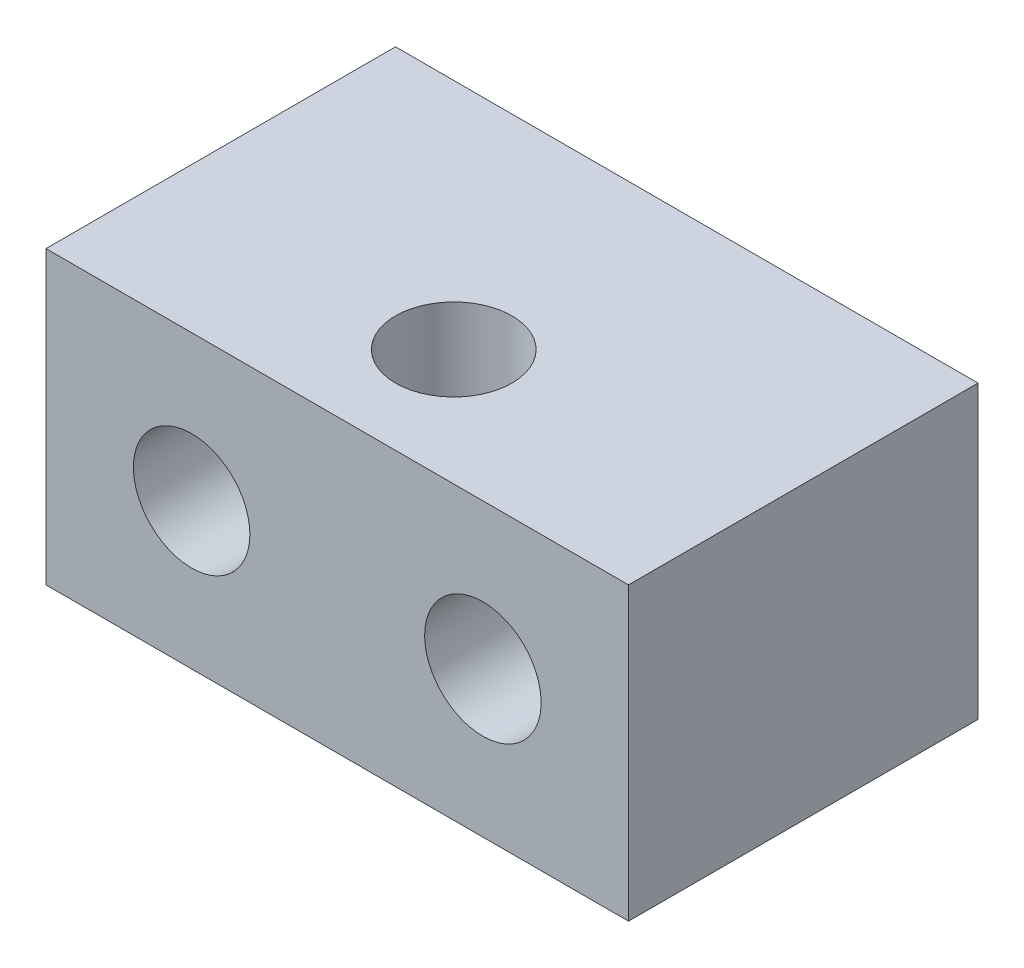
ISO-10303-21;
HEADER;
FILE_DESCRIPTION(('STEP AP214'),'2;1');
FILE_NAME('part.step','',(''),(''),'','','');
FILE_SCHEMA(('AUTOMOTIVE_DESIGN { 1 0 10303 214 1 1 1 1 }'));
ENDSEC;
DATA;
#1=APPLICATION_CONTEXT('core data for automotive mechanical design processes');
#2=APPLICATION_PROTOCOL_DEFINITION('international standard','automotive_design',2000,#1);
#3=PRODUCT_CONTEXT('',#1,'mechanical');
#4=PRODUCT('Part','Part','',(#3));
#5=PRODUCT_RELATED_PRODUCT_CATEGORY('part','',(#4));
#6=PRODUCT_DEFINITION_FORMATION('','',#4);
#7=PRODUCT_DEFINITION_CONTEXT('part definition',#1,'design');
#8=PRODUCT_DEFINITION('design','',#6,#7);
#9=PRODUCT_DEFINITION_SHAPE('','',#8);
#10=(LENGTH_UNIT() NAMED_UNIT(*) SI_UNIT(.MILLI.,.METRE.));
#11=(NAMED_UNIT(*) PLANE_ANGLE_UNIT() SI_UNIT($,.RADIAN.));
#12=(NAMED_UNIT(*) SI_UNIT($,.STERADIAN.) SOLID_ANGLE_UNIT());
#13=UNCERTAINTY_MEASURE_WITH_UNIT(LENGTH_MEASURE(1.E-05),#10,'distance_accuracy_value','');
#14=(GEOMETRIC_REPRESENTATION_CONTEXT(3) GLOBAL_UNCERTAINTY_ASSIGNED_CONTEXT((#13)) GLOBAL_UNIT_ASSIGNED_CONTEXT((#10,
#11,#12)) REPRESENTATION_CONTEXT('',''));
#15=CARTESIAN_POINT('',(0.,0.,0.));
#16=DIRECTION('',(0.,0.,1.));
#17=DIRECTION('',(1.,0.,0.));
#18=AXIS2_PLACEMENT_3D('',#15,#16,#17);
#19=CARTESIAN_POINT('',(0.,5.,0.));
#20=DIRECTION('',(0.,1.,0.));
#21=DIRECTION('',(0.,0.,1.));
#22=AXIS2_PLACEMENT_3D('',#19,#20,#21);
#23=PLANE('',#22);
#24=DIRECTION('',(0.,0.,1.));
#25=VECTOR('',#24,1.);
#26=CARTESIAN_POINT('',(-10.,5.,-6.));
#27=LINE('',#26,#25);
#28=CARTESIAN_POINT('',(-10.,5.,-6.));
#29=VERTEX_POINT('',#28);
#30=CARTESIAN_POINT('',(-10.,5.,6.));
#31=VERTEX_POINT('',#30);
#32=EDGE_CURVE('E87',#29,#31,#27,.T.);
#33=ORIENTED_EDGE('',*,*,#32,.T.);
#34=DIRECTION('',(1.,0.,0.));
#35=VECTOR('',#34,1.);
#36=CARTESIAN_POINT('',(-10.,5.,6.));
#37=LINE('',#36,#35);
#38=CARTESIAN_POINT('',(10.,5.,6.));
#39=VERTEX_POINT('',#38);
#40=EDGE_CURVE('E82',#31,#39,#37,.T.);
#41=ORIENTED_EDGE('',*,*,#40,.T.);
#42=DIRECTION('',(0.,0.,-1.));
#43=VECTOR('',#42,1.);
#44=CARTESIAN_POINT('',(10.,5.,-6.));
#45=LINE('',#44,#43);
#46=CARTESIAN_POINT('',(10.,5.,-6.));
#47=VERTEX_POINT('',#46);
#48=EDGE_CURVE('E85',#39,#47,#45,.T.);
#49=ORIENTED_EDGE('',*,*,#48,.T.);
#50=DIRECTION('',(-1.,0.,0.));
#51=VECTOR('',#50,1.);
#52=CARTESIAN_POINT('',(-10.,5.,-6.));
#53=LINE('',#52,#51);
#54=EDGE_CURVE('E52',#47,#29,#53,.T.);
#55=ORIENTED_EDGE('',*,*,#54,.T.);
#56=EDGE_LOOP('',(#33,#41,#49,#55));
#57=FACE_BOUND('',#56,.T.);
#58=CARTESIAN_POINT('',(0.,5.,2.));
#59=DIRECTION('',(0.,1.,0.));
#60=DIRECTION('',(0.,0.,1.));
#61=AXIS2_PLACEMENT_3D('',#58,#59,#60);
#62=CIRCLE('',#61,2.);
#63=CARTESIAN_POINT('',(0.,5.,4.));
#64=VERTEX_POINT('',#63);
#65=EDGE_CURVE('E102',#64,#64,#62,.T.);
#66=ORIENTED_EDGE('',*,*,#65,.F.);
#67=EDGE_LOOP('',(#66));
#68=FACE_BOUND('',#67,.T.);
#69=ADVANCED_FACE('F35',(#57,#68),#23,.T.);
#70=CARTESIAN_POINT('',(0.,-5.,0.));
#71=DIRECTION('',(0.,1.,0.));
#72=DIRECTION('',(0.,0.,1.));
#73=AXIS2_PLACEMENT_3D('',#70,#71,#72);
#74=PLANE('',#73);
#75=DIRECTION('',(0.,0.,1.));
#76=VECTOR('',#75,1.);
#77=CARTESIAN_POINT('',(-10.,-5.,-6.));
#78=LINE('',#77,#76);
#79=CARTESIAN_POINT('',(-10.,-5.,-6.));
#80=VERTEX_POINT('',#79);
#81=CARTESIAN_POINT('',(-10.,-5.,6.));
#82=VERTEX_POINT('',#81);
#83=EDGE_CURVE('E99',#80,#82,#78,.T.);
#84=ORIENTED_EDGE('',*,*,#83,.F.);
#85=DIRECTION('',(-1.,0.,0.));
#86=VECTOR('',#85,1.);
#87=CARTESIAN_POINT('',(-10.,-5.,-6.));
#88=LINE('',#87,#86);
#89=CARTESIAN_POINT('',(10.,-5.,-6.));
#90=VERTEX_POINT('',#89);
#91=EDGE_CURVE('E75',#90,#80,#88,.T.);
#92=ORIENTED_EDGE('',*,*,#91,.F.);
#93=DIRECTION('',(0.,0.,-1.));
#94=VECTOR('',#93,1.);
#95=CARTESIAN_POINT('',(10.,-5.,-6.));
#96=LINE('',#95,#94);
#97=CARTESIAN_POINT('',(10.,-5.,6.));
#98=VERTEX_POINT('',#97);
#99=EDGE_CURVE('E69',#98,#90,#96,.T.);
#100=ORIENTED_EDGE('',*,*,#99,.F.);
#101=DIRECTION('',(1.,0.,0.));
#102=VECTOR('',#101,1.);
#103=CARTESIAN_POINT('',(-10.,-5.,6.));
#104=LINE('',#103,#102);
#105=EDGE_CURVE('E91',#82,#98,#104,.T.);
#106=ORIENTED_EDGE('',*,*,#105,.F.);
#107=EDGE_LOOP('',(#84,#92,#100,#106));
#108=FACE_BOUND('',#107,.T.);
#109=CARTESIAN_POINT('',(0.,-5.,2.));
#110=DIRECTION('',(0.,1.,0.));
#111=DIRECTION('',(0.,0.,1.));
#112=AXIS2_PLACEMENT_3D('',#109,#110,#111);
#113=CIRCLE('',#112,2.);
#114=CARTESIAN_POINT('',(0.,-5.,4.));
#115=VERTEX_POINT('',#114);
#116=EDGE_CURVE('E114',#115,#115,#113,.T.);
#117=ORIENTED_EDGE('',*,*,#116,.T.);
#118=EDGE_LOOP('',(#117));
#119=FACE_BOUND('',#118,.T.);
#120=ADVANCED_FACE('F110',(#108,#119),#74,.F.);
#121=CARTESIAN_POINT('',(-10.,5.,-6.));
#122=DIRECTION('',(1.,0.,0.));
#123=DIRECTION('',(0.,0.,-1.));
#124=AXIS2_PLACEMENT_3D('',#121,#122,#123);
#125=PLANE('',#124);
#126=ORIENTED_EDGE('',*,*,#83,.T.);
#127=DIRECTION('',(0.,-1.,0.));
#128=VECTOR('',#127,1.);
#129=CARTESIAN_POINT('',(-10.,5.,6.));
#130=LINE('',#129,#128);
#131=EDGE_CURVE('E11',#31,#82,#130,.T.);
#132=ORIENTED_EDGE('',*,*,#131,.F.);
#133=ORIENTED_EDGE('',*,*,#32,.F.);
#134=DIRECTION('',(0.,-1.,0.));
#135=VECTOR('',#134,1.);
#136=CARTESIAN_POINT('',(-10.,5.,-6.));
#137=LINE('',#136,#135);
#138=EDGE_CURVE('E95',#29,#80,#137,.T.);
#139=ORIENTED_EDGE('',*,*,#138,.T.);
#140=EDGE_LOOP('',(#126,#132,#133,#139));
#141=FACE_BOUND('',#140,.T.);
#142=ADVANCED_FACE('F37',(#141),#125,.F.);
#143=CARTESIAN_POINT('',(-10.,5.,6.));
#144=DIRECTION('',(0.,0.,-1.));
#145=DIRECTION('',(-1.,0.,0.));
#146=AXIS2_PLACEMENT_3D('',#143,#144,#145);
#147=PLANE('',#146);
#148=CARTESIAN_POINT('',(-5.,0.,6.));
#149=DIRECTION('',(0.,0.,1.));
#150=DIRECTION('',(1.,0.,0.));
#151=AXIS2_PLACEMENT_3D('',#148,#149,#150);
#152=CIRCLE('',#151,2.);
#153=CARTESIAN_POINT('',(-3.,0.,6.));
#154=VERTEX_POINT('',#153);
#155=EDGE_CURVE('E123',#154,#154,#152,.T.);
#156=ORIENTED_EDGE('',*,*,#155,.F.);
#157=EDGE_LOOP('',(#156));
#158=FACE_BOUND('',#157,.T.);
#159=CARTESIAN_POINT('',(5.,0.,6.));
#160=DIRECTION('',(0.,0.,1.));
#161=DIRECTION('',(-1.,0.,0.));
#162=AXIS2_PLACEMENT_3D('',#159,#160,#161);
#163=CIRCLE('',#162,2.);
#164=CARTESIAN_POINT('',(3.,0.,6.));
#165=VERTEX_POINT('',#164);
#166=EDGE_CURVE('E124',#165,#165,#163,.T.);
#167=ORIENTED_EDGE('',*,*,#166,.F.);
#168=EDGE_LOOP('',(#167));
#169=FACE_BOUND('',#168,.T.);
#170=ORIENTED_EDGE('',*,*,#105,.T.);
#171=DIRECTION('',(0.,-1.,0.));
#172=VECTOR('',#171,1.);
#173=CARTESIAN_POINT('',(10.,5.,6.));
#174=LINE('',#173,#172);
#175=EDGE_CURVE('E44',#39,#98,#174,.T.);
#176=ORIENTED_EDGE('',*,*,#175,.F.);
#177=ORIENTED_EDGE('',*,*,#40,.F.);
#178=ORIENTED_EDGE('',*,*,#131,.T.);
#179=EDGE_LOOP('',(#170,#176,#177,#178));
#180=FACE_BOUND('',#179,.T.);
#181=ADVANCED_FACE('F90',(#158,#169,#180),#147,.F.);
#182=CARTESIAN_POINT('',(10.,5.,-6.));
#183=DIRECTION('',(-1.,0.,0.));
#184=DIRECTION('',(0.,0.,1.));
#185=AXIS2_PLACEMENT_3D('',#182,#183,#184);
#186=PLANE('',#185);
#187=ORIENTED_EDGE('',*,*,#99,.T.);
#188=DIRECTION('',(0.,-1.,0.));
#189=VECTOR('',#188,1.);
#190=CARTESIAN_POINT('',(10.,5.,-6.));
#191=LINE('',#190,#189);
#192=EDGE_CURVE('E92',#47,#90,#191,.T.);
#193=ORIENTED_EDGE('',*,*,#192,.F.);
#194=ORIENTED_EDGE('',*,*,#48,.F.);
#195=ORIENTED_EDGE('',*,*,#175,.T.);
#196=EDGE_LOOP('',(#187,#193,#194,#195));
#197=FACE_BOUND('',#196,.T.);
#198=ADVANCED_FACE('F93',(#197),#186,.F.);
#199=CARTESIAN_POINT('',(-10.,5.,-6.));
#200=DIRECTION('',(0.,0.,1.));
#201=DIRECTION('',(1.,0.,0.));
#202=AXIS2_PLACEMENT_3D('',#199,#200,#201);
#203=PLANE('',#202);
#204=CARTESIAN_POINT('',(-5.,0.,-6.));
#205=DIRECTION('',(0.,0.,1.));
#206=DIRECTION('',(1.,0.,0.));
#207=AXIS2_PLACEMENT_3D('',#204,#205,#206);
#208=CIRCLE('',#207,2.);
#209=CARTESIAN_POINT('',(-3.,0.,-6.));
#210=VERTEX_POINT('',#209);
#211=EDGE_CURVE('E117',#210,#210,#208,.T.);
#212=ORIENTED_EDGE('',*,*,#211,.T.);
#213=EDGE_LOOP('',(#212));
#214=FACE_BOUND('',#213,.T.);
#215=CARTESIAN_POINT('',(5.,0.,-6.));
#216=DIRECTION('',(0.,0.,1.));
#217=DIRECTION('',(-1.,0.,0.));
#218=AXIS2_PLACEMENT_3D('',#215,#216,#217);
#219=CIRCLE('',#218,2.);
#220=CARTESIAN_POINT('',(3.,0.,-6.));
#221=VERTEX_POINT('',#220);
#222=EDGE_CURVE('E120',#221,#221,#219,.T.);
#223=ORIENTED_EDGE('',*,*,#222,.T.);
#224=EDGE_LOOP('',(#223));
#225=FACE_BOUND('',#224,.T.);
#226=ORIENTED_EDGE('',*,*,#91,.T.);
#227=ORIENTED_EDGE('',*,*,#138,.F.);
#228=ORIENTED_EDGE('',*,*,#54,.F.);
#229=ORIENTED_EDGE('',*,*,#192,.T.);
#230=EDGE_LOOP('',(#226,#227,#228,#229));
#231=FACE_BOUND('',#230,.T.);
#232=ADVANCED_FACE('F107',(#214,#225,#231),#203,.F.);
#233=CARTESIAN_POINT('',(0.,5.,2.));
#234=DIRECTION('',(0.,-1.,0.));
#235=DIRECTION('',(0.,0.,-1.));
#236=AXIS2_PLACEMENT_3D('',#233,#234,#235);
#237=CYLINDRICAL_SURFACE('',#236,2.);
#238=ORIENTED_EDGE('',*,*,#65,.T.);
#239=EDGE_LOOP('',(#238));
#240=FACE_BOUND('',#239,.T.);
#241=ORIENTED_EDGE('',*,*,#116,.F.);
#242=EDGE_LOOP('',(#241));
#243=FACE_BOUND('',#242,.T.);
#244=ADVANCED_FACE('F140',(#240,#243),#237,.F.);
#245=CARTESIAN_POINT('',(5.,0.,-6.));
#246=DIRECTION('',(0.,0.,1.));
#247=DIRECTION('',(1.,0.,0.));
#248=AXIS2_PLACEMENT_3D('',#245,#246,#247);
#249=CYLINDRICAL_SURFACE('',#248,2.);
#250=ORIENTED_EDGE('',*,*,#222,.F.);
#251=EDGE_LOOP('',(#250));
#252=FACE_BOUND('',#251,.T.);
#253=ORIENTED_EDGE('',*,*,#166,.T.);
#254=EDGE_LOOP('',(#253));
#255=FACE_BOUND('',#254,.T.);
#256=ADVANCED_FACE('F138',(#252,#255),#249,.F.);
#257=CARTESIAN_POINT('',(-5.,0.,-6.));
#258=DIRECTION('',(0.,0.,1.));
#259=DIRECTION('',(1.,0.,0.));
#260=AXIS2_PLACEMENT_3D('',#257,#258,#259);
#261=CYLINDRICAL_SURFACE('',#260,2.);
#262=ORIENTED_EDGE('',*,*,#211,.F.);
#263=EDGE_LOOP('',(#262));
#264=FACE_BOUND('',#263,.T.);
#265=ORIENTED_EDGE('',*,*,#155,.T.);
#266=EDGE_LOOP('',(#265));
#267=FACE_BOUND('',#266,.T.);
#268=ADVANCED_FACE('F132',(#264,#267),#261,.F.);
#269=CLOSED_SHELL('',(#69,#120,#142,#181,#198,#232,#244,#256,#268));
#270=MANIFOLD_SOLID_BREP('B2',#269);
#271=ADVANCED_BREP_SHAPE_REPRESENTATION('',(#18,#270),#14);
#272=SHAPE_DEFINITION_REPRESENTATION(#9,#271);
ENDSEC;
END-ISO-10303-21;
